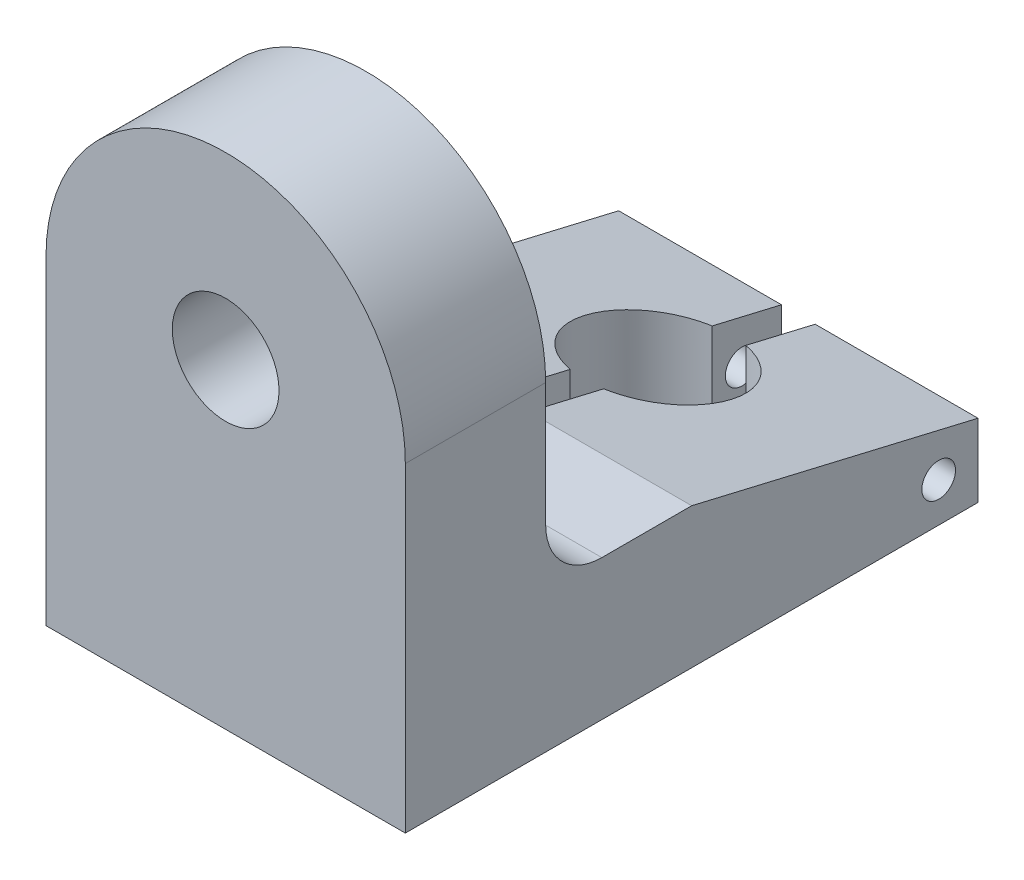
ISO-10303-21;
HEADER;
FILE_DESCRIPTION(('STEP AP214'),'2;1');
FILE_NAME('part.step','',(''),(''),'','','');
FILE_SCHEMA(('AUTOMOTIVE_DESIGN { 1 0 10303 214 1 1 1 1 }'));
ENDSEC;
DATA;
#1=APPLICATION_CONTEXT('core data for automotive mechanical design processes');
#2=APPLICATION_PROTOCOL_DEFINITION('international standard','automotive_design',2000,#1);
#3=PRODUCT_CONTEXT('',#1,'mechanical');
#4=PRODUCT('Part','Part','',(#3));
#5=PRODUCT_RELATED_PRODUCT_CATEGORY('part','',(#4));
#6=PRODUCT_DEFINITION_FORMATION('','',#4);
#7=PRODUCT_DEFINITION_CONTEXT('part definition',#1,'design');
#8=PRODUCT_DEFINITION('design','',#6,#7);
#9=PRODUCT_DEFINITION_SHAPE('','',#8);
#10=(LENGTH_UNIT() NAMED_UNIT(*) SI_UNIT(.MILLI.,.METRE.));
#11=(NAMED_UNIT(*) PLANE_ANGLE_UNIT() SI_UNIT($,.RADIAN.));
#12=(NAMED_UNIT(*) SI_UNIT($,.STERADIAN.) SOLID_ANGLE_UNIT());
#13=UNCERTAINTY_MEASURE_WITH_UNIT(LENGTH_MEASURE(1.E-05),#10,'distance_accuracy_value','');
#14=(GEOMETRIC_REPRESENTATION_CONTEXT(3) GLOBAL_UNCERTAINTY_ASSIGNED_CONTEXT((#13)) GLOBAL_UNIT_ASSIGNED_CONTEXT((#10,
#11,#12)) REPRESENTATION_CONTEXT('',''));
#15=CARTESIAN_POINT('',(0.,0.,0.));
#16=DIRECTION('',(0.,0.,1.));
#17=DIRECTION('',(1.,0.,0.));
#18=AXIS2_PLACEMENT_3D('',#15,#16,#17);
#19=CARTESIAN_POINT('',(-64.,0.,-77.));
#20=DIRECTION('',(0.,0.,-1.));
#21=DIRECTION('',(-1.,0.,0.));
#22=AXIS2_PLACEMENT_3D('',#19,#20,#21);
#23=PLANE('',#22);
#24=DIRECTION('',(1.,0.,0.));
#25=VECTOR('',#24,1.);
#26=CARTESIAN_POINT('',(-64.,-12.,-77.));
#27=LINE('',#26,#25);
#28=CARTESIAN_POINT('',(-29.,-12.,-77.));
#29=VERTEX_POINT('',#28);
#30=CARTESIAN_POINT('',(0.,-12.,-77.));
#31=VERTEX_POINT('',#30);
#32=EDGE_CURVE('E180',#29,#31,#27,.T.);
#33=ORIENTED_EDGE('',*,*,#32,.T.);
#34=DIRECTION('',(0.,1.,0.));
#35=VECTOR('',#34,1.);
#36=CARTESIAN_POINT('',(0.,0.,-77.));
#37=LINE('',#36,#35);
#38=CARTESIAN_POINT('',(0.,-25.,-77.));
#39=VERTEX_POINT('',#38);
#40=EDGE_CURVE('E202',#39,#31,#37,.T.);
#41=ORIENTED_EDGE('',*,*,#40,.F.);
#42=DIRECTION('',(1.,0.,0.));
#43=VECTOR('',#42,1.);
#44=CARTESIAN_POINT('',(-64.,-25.,-77.));
#45=LINE('',#44,#43);
#46=CARTESIAN_POINT('',(-29.,-25.,-77.));
#47=VERTEX_POINT('',#46);
#48=EDGE_CURVE('E188',#47,#39,#45,.T.);
#49=ORIENTED_EDGE('',*,*,#48,.F.);
#50=DIRECTION('',(0.,1.,0.));
#51=VECTOR('',#50,1.);
#52=CARTESIAN_POINT('',(-29.,-25.,-77.));
#53=LINE('',#52,#51);
#54=EDGE_CURVE('E282',#47,#29,#53,.T.);
#55=ORIENTED_EDGE('',*,*,#54,.T.);
#56=EDGE_LOOP('',(#33,#41,#49,#55));
#57=FACE_BOUND('',#56,.T.);
#58=ADVANCED_FACE('F39',(#57),#23,.T.);
#59=CARTESIAN_POINT('',(-32.,-25.,-52.));
#60=DIRECTION('',(0.,1.,0.));
#61=DIRECTION('',(0.,0.,1.));
#62=AXIS2_PLACEMENT_3D('',#59,#60,#61);
#63=CYLINDRICAL_SURFACE('',#62,13.);
#64=DIRECTION('',(0.,1.,0.));
#65=VECTOR('',#64,1.);
#66=CARTESIAN_POINT('',(-29.,-25.,-39.3508893593265));
#67=LINE('',#66,#65);
#68=CARTESIAN_POINT('',(-29.,-25.,-39.3508893593265));
#69=VERTEX_POINT('',#68);
#70=CARTESIAN_POINT('',(-29.,-3.14138573160623,-39.3508893593265));
#71=VERTEX_POINT('',#70);
#72=EDGE_CURVE('E227',#69,#71,#67,.T.);
#73=ORIENTED_EDGE('',*,*,#72,.T.);
#74=CARTESIAN_POINT('',(-32.,-6.11764705882353,-52.));
#75=DIRECTION('',(0.,-0.973417168333576,0.229039333725547));
#76=DIRECTION('',(0.,0.229039333725547,0.973417168333576));
#77=AXIS2_PLACEMENT_3D('',#74,#75,#76);
#78=ELLIPSE('',#77,13.355014091497,13.);
#79=CARTESIAN_POINT('',(-29.,-9.09390838604083,-64.6491106406735));
#80=VERTEX_POINT('',#79);
#81=EDGE_CURVE('E255',#71,#80,#78,.F.);
#82=ORIENTED_EDGE('',*,*,#81,.T.);
#83=DIRECTION('',(0.,1.,0.));
#84=VECTOR('',#83,1.);
#85=CARTESIAN_POINT('',(-29.,-25.,-64.6491106406735));
#86=LINE('',#85,#84);
#87=CARTESIAN_POINT('',(-29.,-25.,-64.6491106406735));
#88=VERTEX_POINT('',#87);
#89=EDGE_CURVE('E230',#80,#88,#86,.F.);
#90=ORIENTED_EDGE('',*,*,#89,.T.);
#91=CARTESIAN_POINT('',(-32.,-25.,-52.));
#92=DIRECTION('',(0.,1.,0.));
#93=DIRECTION('',(0.,0.,1.));
#94=AXIS2_PLACEMENT_3D('',#91,#92,#93);
#95=CIRCLE('',#94,13.);
#96=EDGE_CURVE('E197',#69,#88,#95,.T.);
#97=ORIENTED_EDGE('',*,*,#96,.F.);
#98=EDGE_LOOP('',(#73,#82,#90,#97));
#99=FACE_BOUND('',#98,.T.);
#100=ADVANCED_FACE('F335',(#99),#63,.F.);
#101=CARTESIAN_POINT('',(-32.,32.,0.));
#102=DIRECTION('',(0.,0.,1.));
#103=DIRECTION('',(1.,0.,0.));
#104=AXIS2_PLACEMENT_3D('',#101,#102,#103);
#105=CYLINDRICAL_SURFACE('',#104,32.);
#106=DIRECTION('',(0.,0.,1.));
#107=VECTOR('',#106,1.);
#108=CARTESIAN_POINT('',(0.,32.,0.));
#109=LINE('',#108,#107);
#110=CARTESIAN_POINT('',(0.,32.,0.));
#111=VERTEX_POINT('',#110);
#112=CARTESIAN_POINT('',(0.,32.,25.));
#113=VERTEX_POINT('',#112);
#114=EDGE_CURVE('E210',#111,#113,#109,.T.);
#115=ORIENTED_EDGE('',*,*,#114,.F.);
#116=CARTESIAN_POINT('',(-32.,32.,0.));
#117=DIRECTION('',(0.,0.,-1.));
#118=DIRECTION('',(-1.,0.,0.));
#119=AXIS2_PLACEMENT_3D('',#116,#117,#118);
#120=CIRCLE('',#119,32.);
#121=CARTESIAN_POINT('',(-64.,32.,0.));
#122=VERTEX_POINT('',#121);
#123=EDGE_CURVE('E217',#122,#111,#120,.T.);
#124=ORIENTED_EDGE('',*,*,#123,.F.);
#125=DIRECTION('',(0.,0.,-1.));
#126=VECTOR('',#125,1.);
#127=CARTESIAN_POINT('',(-64.,32.,0.));
#128=LINE('',#127,#126);
#129=CARTESIAN_POINT('',(-64.,32.,25.));
#130=VERTEX_POINT('',#129);
#131=EDGE_CURVE('E214',#130,#122,#128,.T.);
#132=ORIENTED_EDGE('',*,*,#131,.F.);
#133=CARTESIAN_POINT('',(-32.,32.,25.));
#134=DIRECTION('',(0.,0.,1.));
#135=DIRECTION('',(1.,0.,0.));
#136=AXIS2_PLACEMENT_3D('',#133,#134,#135);
#137=CIRCLE('',#136,32.);
#138=EDGE_CURVE('E220',#113,#130,#137,.T.);
#139=ORIENTED_EDGE('',*,*,#138,.F.);
#140=EDGE_LOOP('',(#115,#124,#132,#139));
#141=FACE_BOUND('',#140,.T.);
#142=ADVANCED_FACE('F348',(#141),#105,.T.);
#143=CARTESIAN_POINT('',(-64.,64.,0.));
#144=DIRECTION('',(0.,0.,-1.));
#145=DIRECTION('',(-1.,0.,0.));
#146=AXIS2_PLACEMENT_3D('',#143,#144,#145);
#147=PLANE('',#146);
#148=CARTESIAN_POINT('',(-32.,32.,0.));
#149=DIRECTION('',(0.,0.,-1.));
#150=DIRECTION('',(-1.,0.,0.));
#151=AXIS2_PLACEMENT_3D('',#148,#149,#150);
#152=CIRCLE('',#151,17.5);
#153=CARTESIAN_POINT('',(-49.5,32.,0.));
#154=VERTEX_POINT('',#153);
#155=EDGE_CURVE('E11',#154,#154,#152,.F.);
#156=ORIENTED_EDGE('',*,*,#155,.T.);
#157=EDGE_LOOP('',(#156));
#158=FACE_BOUND('',#157,.T.);
#159=DIRECTION('',(0.,1.,0.));
#160=VECTOR('',#159,1.);
#161=CARTESIAN_POINT('',(0.,64.,0.));
#162=LINE('',#161,#160);
#163=CARTESIAN_POINT('',(0.,10.,0.));
#164=VERTEX_POINT('',#163);
#165=EDGE_CURVE('E194',#164,#111,#162,.T.);
#166=ORIENTED_EDGE('',*,*,#165,.F.);
#167=DIRECTION('',(1.,0.,0.));
#168=VECTOR('',#167,1.);
#169=CARTESIAN_POINT('',(-64.,10.,0.));
#170=LINE('',#169,#168);
#171=CARTESIAN_POINT('',(-64.,10.,0.));
#172=VERTEX_POINT('',#171);
#173=EDGE_CURVE('E61',#164,#172,#170,.F.);
#174=ORIENTED_EDGE('',*,*,#173,.T.);
#175=DIRECTION('',(0.,1.,0.));
#176=VECTOR('',#175,1.);
#177=CARTESIAN_POINT('',(-64.,64.,0.));
#178=LINE('',#177,#176);
#179=EDGE_CURVE('E207',#172,#122,#178,.T.);
#180=ORIENTED_EDGE('',*,*,#179,.T.);
#181=ORIENTED_EDGE('',*,*,#123,.T.);
#182=EDGE_LOOP('',(#166,#174,#180,#181));
#183=FACE_BOUND('',#182,.T.);
#184=ADVANCED_FACE('F374',(#158,#183),#147,.T.);
#185=CARTESIAN_POINT('',(-64.,0.,0.));
#186=DIRECTION('',(0.,1.,0.));
#187=DIRECTION('',(0.,0.,1.));
#188=AXIS2_PLACEMENT_3D('',#185,#186,#187);
#189=PLANE('',#188);
#190=DIRECTION('',(0.,0.,1.));
#191=VECTOR('',#190,1.);
#192=CARTESIAN_POINT('',(-64.,0.,0.));
#193=LINE('',#192,#191);
#194=CARTESIAN_POINT('',(-64.,0.,-26.));
#195=VERTEX_POINT('',#194);
#196=CARTESIAN_POINT('',(-64.,0.,-10.));
#197=VERTEX_POINT('',#196);
#198=EDGE_CURVE('E176',#195,#197,#193,.T.);
#199=ORIENTED_EDGE('',*,*,#198,.T.);
#200=DIRECTION('',(1.,0.,0.));
#201=VECTOR('',#200,1.);
#202=CARTESIAN_POINT('',(0.,0.,-10.));
#203=LINE('',#202,#201);
#204=CARTESIAN_POINT('',(0.,0.,-10.));
#205=VERTEX_POINT('',#204);
#206=EDGE_CURVE('E235',#197,#205,#203,.T.);
#207=ORIENTED_EDGE('',*,*,#206,.T.);
#208=DIRECTION('',(0.,0.,1.));
#209=VECTOR('',#208,1.);
#210=CARTESIAN_POINT('',(0.,0.,0.));
#211=LINE('',#210,#209);
#212=CARTESIAN_POINT('',(0.,0.,-26.));
#213=VERTEX_POINT('',#212);
#214=EDGE_CURVE('E205',#213,#205,#211,.T.);
#215=ORIENTED_EDGE('',*,*,#214,.F.);
#216=DIRECTION('',(1.,0.,0.));
#217=VECTOR('',#216,1.);
#218=CARTESIAN_POINT('',(-64.,0.,-26.));
#219=LINE('',#218,#217);
#220=CARTESIAN_POINT('',(-29.,0.,-26.));
#221=VERTEX_POINT('',#220);
#222=EDGE_CURVE('E168',#221,#213,#219,.T.);
#223=ORIENTED_EDGE('',*,*,#222,.F.);
#224=DIRECTION('',(0.,0.,-1.));
#225=VECTOR('',#224,1.);
#226=CARTESIAN_POINT('',(-29.,0.,-77.));
#227=LINE('',#226,#225);
#228=CARTESIAN_POINT('',(-29.,0.,-13.));
#229=VERTEX_POINT('',#228);
#230=EDGE_CURVE('E270',#229,#221,#227,.T.);
#231=ORIENTED_EDGE('',*,*,#230,.F.);
#232=DIRECTION('',(1.,0.,0.));
#233=VECTOR('',#232,1.);
#234=CARTESIAN_POINT('',(-35.,0.,-13.));
#235=LINE('',#234,#233);
#236=CARTESIAN_POINT('',(-35.,0.,-13.));
#237=VERTEX_POINT('',#236);
#238=EDGE_CURVE('E286',#237,#229,#235,.T.);
#239=ORIENTED_EDGE('',*,*,#238,.F.);
#240=DIRECTION('',(0.,0.,1.));
#241=VECTOR('',#240,1.);
#242=CARTESIAN_POINT('',(-35.,0.,-77.));
#243=LINE('',#242,#241);
#244=CARTESIAN_POINT('',(-35.,0.,-26.));
#245=VERTEX_POINT('',#244);
#246=EDGE_CURVE('E179',#245,#237,#243,.T.);
#247=ORIENTED_EDGE('',*,*,#246,.F.);
#248=EDGE_CURVE('E160',#195,#245,#219,.T.);
#249=ORIENTED_EDGE('',*,*,#248,.F.);
#250=EDGE_LOOP('',(#199,#207,#215,#223,#231,#239,#247,#249));
#251=FACE_BOUND('',#250,.T.);
#252=ADVANCED_FACE('F174',(#251),#189,.T.);
#253=CARTESIAN_POINT('',(-64.,-12.,-77.));
#254=VERTEX_POINT('',#253);
#255=CARTESIAN_POINT('',(-35.,-12.,-77.));
#256=VERTEX_POINT('',#255);
#257=EDGE_CURVE('E163',#254,#256,#27,.T.);
#258=ORIENTED_EDGE('',*,*,#257,.T.);
#259=DIRECTION('',(0.,1.,0.));
#260=VECTOR('',#259,1.);
#261=CARTESIAN_POINT('',(-35.,-25.,-77.));
#262=LINE('',#261,#260);
#263=CARTESIAN_POINT('',(-35.,-25.,-77.));
#264=VERTEX_POINT('',#263);
#265=EDGE_CURVE('E295',#264,#256,#262,.T.);
#266=ORIENTED_EDGE('',*,*,#265,.F.);
#267=CARTESIAN_POINT('',(-64.,-25.,-77.));
#268=VERTEX_POINT('',#267);
#269=EDGE_CURVE('E208',#268,#264,#45,.T.);
#270=ORIENTED_EDGE('',*,*,#269,.F.);
#271=DIRECTION('',(0.,1.,0.));
#272=VECTOR('',#271,1.);
#273=CARTESIAN_POINT('',(-64.,0.,-77.));
#274=LINE('',#273,#272);
#275=EDGE_CURVE('E185',#268,#254,#274,.T.);
#276=ORIENTED_EDGE('',*,*,#275,.T.);
#277=EDGE_LOOP('',(#258,#266,#270,#276));
#278=FACE_BOUND('',#277,.T.);
#279=ADVANCED_FACE('F313',(#278),#23,.T.);
#280=CARTESIAN_POINT('',(-64.,-25.,-77.));
#281=DIRECTION('',(0.,-1.,0.));
#282=DIRECTION('',(0.,0.,-1.));
#283=AXIS2_PLACEMENT_3D('',#280,#281,#282);
#284=PLANE('',#283);
#285=DIRECTION('',(0.,0.,-1.));
#286=VECTOR('',#285,1.);
#287=CARTESIAN_POINT('',(-29.,-25.,-77.));
#288=LINE('',#287,#286);
#289=EDGE_CURVE('E275',#88,#47,#288,.T.);
#290=ORIENTED_EDGE('',*,*,#289,.T.);
#291=ORIENTED_EDGE('',*,*,#48,.T.);
#292=DIRECTION('',(0.,0.,-1.));
#293=VECTOR('',#292,1.);
#294=CARTESIAN_POINT('',(0.,-25.,-77.));
#295=LINE('',#294,#293);
#296=CARTESIAN_POINT('',(0.,-25.,25.));
#297=VERTEX_POINT('',#296);
#298=EDGE_CURVE('E199',#297,#39,#295,.T.);
#299=ORIENTED_EDGE('',*,*,#298,.F.);
#300=DIRECTION('',(1.,0.,0.));
#301=VECTOR('',#300,1.);
#302=CARTESIAN_POINT('',(-64.,-25.,25.));
#303=LINE('',#302,#301);
#304=CARTESIAN_POINT('',(-64.,-25.,25.));
#305=VERTEX_POINT('',#304);
#306=EDGE_CURVE('E184',#305,#297,#303,.T.);
#307=ORIENTED_EDGE('',*,*,#306,.F.);
#308=DIRECTION('',(0.,0.,-1.));
#309=VECTOR('',#308,1.);
#310=CARTESIAN_POINT('',(-64.,-25.,-77.));
#311=LINE('',#310,#309);
#312=EDGE_CURVE('E190',#305,#268,#311,.T.);
#313=ORIENTED_EDGE('',*,*,#312,.T.);
#314=ORIENTED_EDGE('',*,*,#269,.T.);
#315=DIRECTION('',(0.,0.,1.));
#316=VECTOR('',#315,1.);
#317=CARTESIAN_POINT('',(-35.,-25.,-77.));
#318=LINE('',#317,#316);
#319=CARTESIAN_POINT('',(-35.,-25.,-64.6491106406735));
#320=VERTEX_POINT('',#319);
#321=EDGE_CURVE('E276',#264,#320,#318,.T.);
#322=ORIENTED_EDGE('',*,*,#321,.T.);
#323=CARTESIAN_POINT('',(-35.,-25.,-39.3508893593265));
#324=VERTEX_POINT('',#323);
#325=EDGE_CURVE('E291',#320,#324,#95,.T.);
#326=ORIENTED_EDGE('',*,*,#325,.T.);
#327=CARTESIAN_POINT('',(-35.,-25.,-13.));
#328=VERTEX_POINT('',#327);
#329=EDGE_CURVE('E274',#324,#328,#318,.T.);
#330=ORIENTED_EDGE('',*,*,#329,.T.);
#331=DIRECTION('',(1.,0.,0.));
#332=VECTOR('',#331,1.);
#333=CARTESIAN_POINT('',(-35.,-25.,-13.));
#334=LINE('',#333,#332);
#335=CARTESIAN_POINT('',(-29.,-25.,-13.));
#336=VERTEX_POINT('',#335);
#337=EDGE_CURVE('E279',#328,#336,#334,.T.);
#338=ORIENTED_EDGE('',*,*,#337,.T.);
#339=EDGE_CURVE('E271',#336,#69,#288,.T.);
#340=ORIENTED_EDGE('',*,*,#339,.T.);
#341=ORIENTED_EDGE('',*,*,#96,.T.);
#342=EDGE_LOOP('',(#290,#291,#299,#307,#313,#314,#322,#326,#330,#338,#340,#341));
#343=FACE_BOUND('',#342,.T.);
#344=ADVANCED_FACE('F309',(#343),#284,.T.);
#345=CARTESIAN_POINT('',(-64.,-25.,25.));
#346=DIRECTION('',(0.,0.,1.));
#347=DIRECTION('',(1.,0.,0.));
#348=AXIS2_PLACEMENT_3D('',#345,#346,#347);
#349=PLANE('',#348);
#350=CARTESIAN_POINT('',(-32.,32.,25.));
#351=DIRECTION('',(0.,0.,-1.));
#352=DIRECTION('',(-1.,0.,0.));
#353=AXIS2_PLACEMENT_3D('',#350,#351,#352);
#354=CIRCLE('',#353,9.5);
#355=CARTESIAN_POINT('',(-41.5,32.,25.));
#356=VERTEX_POINT('',#355);
#357=EDGE_CURVE('E417',#356,#356,#354,.T.);
#358=ORIENTED_EDGE('',*,*,#357,.T.);
#359=EDGE_LOOP('',(#358));
#360=FACE_BOUND('',#359,.T.);
#361=DIRECTION('',(0.,-1.,0.));
#362=VECTOR('',#361,1.);
#363=CARTESIAN_POINT('',(0.,-25.,25.));
#364=LINE('',#363,#362);
#365=EDGE_CURVE('E196',#113,#297,#364,.T.);
#366=ORIENTED_EDGE('',*,*,#365,.F.);
#367=ORIENTED_EDGE('',*,*,#138,.T.);
#368=DIRECTION('',(0.,-1.,0.));
#369=VECTOR('',#368,1.);
#370=CARTESIAN_POINT('',(-64.,-25.,25.));
#371=LINE('',#370,#369);
#372=EDGE_CURVE('E303',#130,#305,#371,.T.);
#373=ORIENTED_EDGE('',*,*,#372,.T.);
#374=ORIENTED_EDGE('',*,*,#306,.T.);
#375=EDGE_LOOP('',(#366,#367,#373,#374));
#376=FACE_BOUND('',#375,.T.);
#377=ADVANCED_FACE('F344',(#360,#376),#349,.T.);
#378=CARTESIAN_POINT('',(-64.,0.,0.));
#379=DIRECTION('',(1.,0.,0.));
#380=DIRECTION('',(0.,0.,-1.));
#381=AXIS2_PLACEMENT_3D('',#378,#379,#380);
#382=PLANE('',#381);
#383=CARTESIAN_POINT('',(-64.,-18.,-70.));
#384=DIRECTION('',(1.,0.,0.));
#385=DIRECTION('',(0.,0.,-1.));
#386=AXIS2_PLACEMENT_3D('',#383,#384,#385);
#387=CIRCLE('',#386,3.00000000000001);
#388=CARTESIAN_POINT('',(-64.,-18.,-73.));
#389=VERTEX_POINT('',#388);
#390=EDGE_CURVE('E240',#389,#389,#387,.T.);
#391=ORIENTED_EDGE('',*,*,#390,.T.);
#392=EDGE_LOOP('',(#391));
#393=FACE_BOUND('',#392,.T.);
#394=ORIENTED_EDGE('',*,*,#198,.F.);
#395=DIRECTION('',(0.,-0.229039333725547,-0.973417168333576));
#396=VECTOR('',#395,1.);
#397=CARTESIAN_POINT('',(-64.,0.,-26.));
#398=LINE('',#397,#396);
#399=EDGE_CURVE('E157',#195,#254,#398,.T.);
#400=ORIENTED_EDGE('',*,*,#399,.T.);
#401=ORIENTED_EDGE('',*,*,#275,.F.);
#402=ORIENTED_EDGE('',*,*,#312,.F.);
#403=ORIENTED_EDGE('',*,*,#372,.F.);
#404=ORIENTED_EDGE('',*,*,#131,.T.);
#405=ORIENTED_EDGE('',*,*,#179,.F.);
#406=CARTESIAN_POINT('',(-64.,10.,-10.));
#407=DIRECTION('',(1.,0.,0.));
#408=DIRECTION('',(0.,0.,-1.));
#409=AXIS2_PLACEMENT_3D('',#406,#407,#408);
#410=CIRCLE('',#409,10.);
#411=EDGE_CURVE('E47',#172,#197,#410,.T.);
#412=ORIENTED_EDGE('',*,*,#411,.T.);
#413=EDGE_LOOP('',(#394,#400,#401,#402,#403,#404,#405,#412));
#414=FACE_BOUND('',#413,.T.);
#415=ADVANCED_FACE('F182',(#393,#414),#382,.F.);
#416=CARTESIAN_POINT('',(0.,0.,0.));
#417=DIRECTION('',(1.,0.,0.));
#418=DIRECTION('',(0.,0.,-1.));
#419=AXIS2_PLACEMENT_3D('',#416,#417,#418);
#420=PLANE('',#419);
#421=CARTESIAN_POINT('',(0.,-18.,-70.));
#422=DIRECTION('',(1.,0.,0.));
#423=DIRECTION('',(0.,0.,-1.));
#424=AXIS2_PLACEMENT_3D('',#421,#422,#423);
#425=CIRCLE('',#424,3.00000000000001);
#426=CARTESIAN_POINT('',(0.,-18.,-73.));
#427=VERTEX_POINT('',#426);
#428=EDGE_CURVE('E416',#427,#427,#425,.T.);
#429=ORIENTED_EDGE('',*,*,#428,.F.);
#430=EDGE_LOOP('',(#429));
#431=FACE_BOUND('',#430,.T.);
#432=DIRECTION('',(0.,-0.229039333725547,-0.973417168333576));
#433=VECTOR('',#432,1.);
#434=CARTESIAN_POINT('',(0.,0.,-26.));
#435=LINE('',#434,#433);
#436=EDGE_CURVE('E169',#213,#31,#435,.T.);
#437=ORIENTED_EDGE('',*,*,#436,.F.);
#438=ORIENTED_EDGE('',*,*,#214,.T.);
#439=CARTESIAN_POINT('',(0.,10.,-10.));
#440=DIRECTION('',(1.,0.,0.));
#441=DIRECTION('',(0.,0.,-1.));
#442=AXIS2_PLACEMENT_3D('',#439,#440,#441);
#443=CIRCLE('',#442,10.);
#444=EDGE_CURVE('E54',#205,#164,#443,.F.);
#445=ORIENTED_EDGE('',*,*,#444,.T.);
#446=ORIENTED_EDGE('',*,*,#165,.T.);
#447=ORIENTED_EDGE('',*,*,#114,.T.);
#448=ORIENTED_EDGE('',*,*,#365,.T.);
#449=ORIENTED_EDGE('',*,*,#298,.T.);
#450=ORIENTED_EDGE('',*,*,#40,.T.);
#451=EDGE_LOOP('',(#437,#438,#445,#446,#447,#448,#449,#450));
#452=FACE_BOUND('',#451,.T.);
#453=ADVANCED_FACE('F247',(#431,#452),#420,.T.);
#454=DIRECTION('',(0.,1.,0.));
#455=VECTOR('',#454,1.);
#456=CARTESIAN_POINT('',(-35.,-25.,-64.6491106406735));
#457=LINE('',#456,#455);
#458=CARTESIAN_POINT('',(-35.,-9.09390838604082,-64.6491106406735));
#459=VERTEX_POINT('',#458);
#460=EDGE_CURVE('E222',#320,#459,#457,.T.);
#461=ORIENTED_EDGE('',*,*,#460,.T.);
#462=CARTESIAN_POINT('',(-32.,-6.11764705882353,-52.));
#463=DIRECTION('',(0.,-0.973417168333576,0.229039333725547));
#464=DIRECTION('',(0.,0.229039333725547,0.973417168333576));
#465=AXIS2_PLACEMENT_3D('',#462,#463,#464);
#466=ELLIPSE('',#465,13.355014091497,13.);
#467=CARTESIAN_POINT('',(-35.,-3.14138573160623,-39.3508893593265));
#468=VERTEX_POINT('',#467);
#469=EDGE_CURVE('E264',#459,#468,#466,.F.);
#470=ORIENTED_EDGE('',*,*,#469,.T.);
#471=DIRECTION('',(0.,1.,0.));
#472=VECTOR('',#471,1.);
#473=CARTESIAN_POINT('',(-35.,-25.,-39.3508893593265));
#474=LINE('',#473,#472);
#475=EDGE_CURVE('E225',#468,#324,#474,.F.);
#476=ORIENTED_EDGE('',*,*,#475,.T.);
#477=ORIENTED_EDGE('',*,*,#325,.F.);
#478=EDGE_LOOP('',(#461,#470,#476,#477));
#479=FACE_BOUND('',#478,.T.);
#480=ADVANCED_FACE('F321',(#479),#63,.F.);
#481=CARTESIAN_POINT('',(-35.,-25.,-77.));
#482=DIRECTION('',(-1.,0.,0.));
#483=DIRECTION('',(0.,0.,1.));
#484=AXIS2_PLACEMENT_3D('',#481,#482,#483);
#485=PLANE('',#484);
#486=CARTESIAN_POINT('',(-35.,-18.,-70.));
#487=DIRECTION('',(-1.,0.,0.));
#488=DIRECTION('',(0.,0.,1.));
#489=AXIS2_PLACEMENT_3D('',#486,#487,#488);
#490=CIRCLE('',#489,3.00000000000001);
#491=CARTESIAN_POINT('',(-35.,-18.,-67.));
#492=VERTEX_POINT('',#491);
#493=EDGE_CURVE('E239',#492,#492,#490,.T.);
#494=ORIENTED_EDGE('',*,*,#493,.T.);
#495=EDGE_LOOP('',(#494));
#496=FACE_BOUND('',#495,.T.);
#497=ORIENTED_EDGE('',*,*,#265,.T.);
#498=DIRECTION('',(0.,0.229039333725547,0.973417168333576));
#499=VECTOR('',#498,1.);
#500=CARTESIAN_POINT('',(-35.,-12.6819672131148,-79.8983606557377));
#501=LINE('',#500,#499);
#502=EDGE_CURVE('E267',#256,#459,#501,.T.);
#503=ORIENTED_EDGE('',*,*,#502,.T.);
#504=ORIENTED_EDGE('',*,*,#460,.F.);
#505=ORIENTED_EDGE('',*,*,#321,.F.);
#506=EDGE_LOOP('',(#497,#503,#504,#505));
#507=FACE_BOUND('',#506,.T.);
#508=ADVANCED_FACE('F316',(#496,#507),#485,.F.);
#509=CARTESIAN_POINT('',(-29.,-25.,-77.));
#510=DIRECTION('',(1.,0.,0.));
#511=DIRECTION('',(0.,0.,-1.));
#512=AXIS2_PLACEMENT_3D('',#509,#510,#511);
#513=PLANE('',#512);
#514=ORIENTED_EDGE('',*,*,#230,.T.);
#515=DIRECTION('',(0.,-0.229039333725547,-0.973417168333576));
#516=VECTOR('',#515,1.);
#517=CARTESIAN_POINT('',(-29.,-12.6819672131148,-79.8983606557377));
#518=LINE('',#517,#516);
#519=EDGE_CURVE('E259',#221,#71,#518,.T.);
#520=ORIENTED_EDGE('',*,*,#519,.T.);
#521=ORIENTED_EDGE('',*,*,#72,.F.);
#522=ORIENTED_EDGE('',*,*,#339,.F.);
#523=DIRECTION('',(0.,1.,0.));
#524=VECTOR('',#523,1.);
#525=CARTESIAN_POINT('',(-29.,-25.,-13.));
#526=LINE('',#525,#524);
#527=EDGE_CURVE('E289',#336,#229,#526,.T.);
#528=ORIENTED_EDGE('',*,*,#527,.T.);
#529=EDGE_LOOP('',(#514,#520,#521,#522,#528));
#530=FACE_BOUND('',#529,.T.);
#531=ADVANCED_FACE('F333',(#530),#513,.F.);
#532=ORIENTED_EDGE('',*,*,#475,.F.);
#533=DIRECTION('',(0.,0.229039333725547,0.973417168333576));
#534=VECTOR('',#533,1.);
#535=CARTESIAN_POINT('',(-35.,-12.6819672131148,-79.8983606557377));
#536=LINE('',#535,#534);
#537=EDGE_CURVE('E262',#468,#245,#536,.T.);
#538=ORIENTED_EDGE('',*,*,#537,.T.);
#539=ORIENTED_EDGE('',*,*,#246,.T.);
#540=DIRECTION('',(0.,1.,0.));
#541=VECTOR('',#540,1.);
#542=CARTESIAN_POINT('',(-35.,-25.,-13.));
#543=LINE('',#542,#541);
#544=EDGE_CURVE('E292',#328,#237,#543,.T.);
#545=ORIENTED_EDGE('',*,*,#544,.F.);
#546=ORIENTED_EDGE('',*,*,#329,.F.);
#547=EDGE_LOOP('',(#532,#538,#539,#545,#546));
#548=FACE_BOUND('',#547,.T.);
#549=ADVANCED_FACE('F325',(#548),#485,.F.);
#550=CARTESIAN_POINT('',(-35.,-25.,-13.));
#551=DIRECTION('',(0.,0.,1.));
#552=DIRECTION('',(1.,0.,0.));
#553=AXIS2_PLACEMENT_3D('',#550,#551,#552);
#554=PLANE('',#553);
#555=ORIENTED_EDGE('',*,*,#238,.T.);
#556=ORIENTED_EDGE('',*,*,#527,.F.);
#557=ORIENTED_EDGE('',*,*,#337,.F.);
#558=ORIENTED_EDGE('',*,*,#544,.T.);
#559=EDGE_LOOP('',(#555,#556,#557,#558));
#560=FACE_BOUND('',#559,.T.);
#561=ADVANCED_FACE('F330',(#560),#554,.F.);
#562=CARTESIAN_POINT('',(-29.,-18.,-70.));
#563=DIRECTION('',(1.,0.,0.));
#564=DIRECTION('',(0.,0.,-1.));
#565=AXIS2_PLACEMENT_3D('',#562,#563,#564);
#566=CIRCLE('',#565,3.00000000000001);
#567=CARTESIAN_POINT('',(-29.,-18.,-73.));
#568=VERTEX_POINT('',#567);
#569=EDGE_CURVE('E236',#568,#568,#566,.T.);
#570=ORIENTED_EDGE('',*,*,#569,.T.);
#571=EDGE_LOOP('',(#570));
#572=FACE_BOUND('',#571,.T.);
#573=ORIENTED_EDGE('',*,*,#89,.F.);
#574=DIRECTION('',(0.,-0.229039333725547,-0.973417168333576));
#575=VECTOR('',#574,1.);
#576=CARTESIAN_POINT('',(-29.,-12.6819672131148,-79.8983606557377));
#577=LINE('',#576,#575);
#578=EDGE_CURVE('E232',#80,#29,#577,.T.);
#579=ORIENTED_EDGE('',*,*,#578,.T.);
#580=ORIENTED_EDGE('',*,*,#54,.F.);
#581=ORIENTED_EDGE('',*,*,#289,.F.);
#582=EDGE_LOOP('',(#573,#579,#580,#581));
#583=FACE_BOUND('',#582,.T.);
#584=ADVANCED_FACE('F388',(#572,#583),#513,.F.);
#585=CARTESIAN_POINT('',(-64.,0.,-26.));
#586=DIRECTION('',(0.,-0.973417168333576,0.229039333725547));
#587=DIRECTION('',(0.,-0.229039333725547,-0.973417168333576));
#588=AXIS2_PLACEMENT_3D('',#585,#586,#587);
#589=PLANE('',#588);
#590=ORIENTED_EDGE('',*,*,#222,.T.);
#591=ORIENTED_EDGE('',*,*,#436,.T.);
#592=ORIENTED_EDGE('',*,*,#32,.F.);
#593=ORIENTED_EDGE('',*,*,#578,.F.);
#594=ORIENTED_EDGE('',*,*,#81,.F.);
#595=ORIENTED_EDGE('',*,*,#519,.F.);
#596=EDGE_LOOP('',(#590,#591,#592,#593,#594,#595));
#597=FACE_BOUND('',#596,.T.);
#598=ADVANCED_FACE('F391',(#597),#589,.F.);
#599=ORIENTED_EDGE('',*,*,#257,.F.);
#600=ORIENTED_EDGE('',*,*,#399,.F.);
#601=ORIENTED_EDGE('',*,*,#248,.T.);
#602=ORIENTED_EDGE('',*,*,#537,.F.);
#603=ORIENTED_EDGE('',*,*,#469,.F.);
#604=ORIENTED_EDGE('',*,*,#502,.F.);
#605=EDGE_LOOP('',(#599,#600,#601,#602,#603,#604));
#606=FACE_BOUND('',#605,.T.);
#607=ADVANCED_FACE('F159',(#606),#589,.F.);
#608=CARTESIAN_POINT('',(-64.,-18.,-70.));
#609=DIRECTION('',(1.,0.,0.));
#610=DIRECTION('',(0.,0.,-1.));
#611=AXIS2_PLACEMENT_3D('',#608,#609,#610);
#612=CYLINDRICAL_SURFACE('',#611,3.00000000000001);
#613=ORIENTED_EDGE('',*,*,#428,.T.);
#614=EDGE_LOOP('',(#613));
#615=FACE_BOUND('',#614,.T.);
#616=ORIENTED_EDGE('',*,*,#569,.F.);
#617=EDGE_LOOP('',(#616));
#618=FACE_BOUND('',#617,.T.);
#619=ADVANCED_FACE('F399',(#615,#618),#612,.F.);
#620=ORIENTED_EDGE('',*,*,#390,.F.);
#621=EDGE_LOOP('',(#620));
#622=FACE_BOUND('',#621,.T.);
#623=ORIENTED_EDGE('',*,*,#493,.F.);
#624=EDGE_LOOP('',(#623));
#625=FACE_BOUND('',#624,.T.);
#626=ADVANCED_FACE('F400',(#622,#625),#612,.F.);
#627=CARTESIAN_POINT('',(-32.,32.,-5.));
#628=DIRECTION('',(0.,0.,-1.));
#629=DIRECTION('',(-1.,0.,0.));
#630=AXIS2_PLACEMENT_3D('',#627,#628,#629);
#631=PLANE('',#630);
#632=CARTESIAN_POINT('',(-32.,32.,-5.));
#633=DIRECTION('',(0.,0.,-1.));
#634=DIRECTION('',(-1.,0.,0.));
#635=AXIS2_PLACEMENT_3D('',#632,#633,#634);
#636=CIRCLE('',#635,9.5);
#637=CARTESIAN_POINT('',(-41.5,32.,-5.));
#638=VERTEX_POINT('',#637);
#639=EDGE_CURVE('E411',#638,#638,#636,.T.);
#640=ORIENTED_EDGE('',*,*,#639,.F.);
#641=EDGE_LOOP('',(#640));
#642=FACE_BOUND('',#641,.T.);
#643=CARTESIAN_POINT('',(-32.,32.,-5.));
#644=DIRECTION('',(0.,0.,-1.));
#645=DIRECTION('',(-1.,0.,0.));
#646=AXIS2_PLACEMENT_3D('',#643,#644,#645);
#647=CIRCLE('',#646,12.5);
#648=CARTESIAN_POINT('',(-44.5,32.,-5.));
#649=VERTEX_POINT('',#648);
#650=EDGE_CURVE('E414',#649,#649,#647,.T.);
#651=ORIENTED_EDGE('',*,*,#650,.T.);
#652=EDGE_LOOP('',(#651));
#653=FACE_BOUND('',#652,.T.);
#654=ADVANCED_FACE('F357',(#642,#653),#631,.T.);
#655=CARTESIAN_POINT('',(-32.,32.,25.));
#656=DIRECTION('',(0.,0.,-1.));
#657=DIRECTION('',(-1.,0.,0.));
#658=AXIS2_PLACEMENT_3D('',#655,#656,#657);
#659=CYLINDRICAL_SURFACE('',#658,9.5);
#660=CARTESIAN_POINT('',(-41.5,32.,25.));
#661=CARTESIAN_POINT('',(-41.5,32.,24.6875));
#662=CARTESIAN_POINT('',(-41.5,32.,24.375));
#663=CARTESIAN_POINT('',(-41.5,32.,23.75));
#664=CARTESIAN_POINT('',(-41.5,32.,23.4375));
#665=CARTESIAN_POINT('',(-41.5,32.,22.8125));
#666=CARTESIAN_POINT('',(-41.5,32.,22.5));
#667=CARTESIAN_POINT('',(-41.5,32.,21.875));
#668=CARTESIAN_POINT('',(-41.5,32.,21.5625));
#669=CARTESIAN_POINT('',(-41.5,32.,20.9375));
#670=CARTESIAN_POINT('',(-41.5,32.,20.625));
#671=CARTESIAN_POINT('',(-41.5,32.,20.));
#672=CARTESIAN_POINT('',(-41.5,32.,19.6875));
#673=CARTESIAN_POINT('',(-41.5,32.,19.0625));
#674=CARTESIAN_POINT('',(-41.5,32.,18.75));
#675=CARTESIAN_POINT('',(-41.5,32.,18.125));
#676=CARTESIAN_POINT('',(-41.5,32.,17.8125));
#677=CARTESIAN_POINT('',(-41.5,32.,17.1875));
#678=CARTESIAN_POINT('',(-41.5,32.,16.875));
#679=CARTESIAN_POINT('',(-41.5,32.,16.25));
#680=CARTESIAN_POINT('',(-41.5,32.,15.9375));
#681=CARTESIAN_POINT('',(-41.5,32.,15.3125));
#682=CARTESIAN_POINT('',(-41.5,32.,15.));
#683=CARTESIAN_POINT('',(-41.5,32.,14.375));
#684=CARTESIAN_POINT('',(-41.5,32.,14.0625));
#685=CARTESIAN_POINT('',(-41.5,32.,13.4375));
#686=CARTESIAN_POINT('',(-41.5,32.,13.125));
#687=CARTESIAN_POINT('',(-41.5,32.,12.5));
#688=CARTESIAN_POINT('',(-41.5,32.,12.1875));
#689=CARTESIAN_POINT('',(-41.5,32.,11.5625));
#690=CARTESIAN_POINT('',(-41.5,32.,11.25));
#691=CARTESIAN_POINT('',(-41.5,32.,10.625));
#692=CARTESIAN_POINT('',(-41.5,32.,10.3125));
#693=CARTESIAN_POINT('',(-41.5,32.,9.6875));
#694=CARTESIAN_POINT('',(-41.5,32.,9.375));
#695=CARTESIAN_POINT('',(-41.5,32.,8.75));
#696=CARTESIAN_POINT('',(-41.5,32.,8.4375));
#697=CARTESIAN_POINT('',(-41.5,32.,7.8125));
#698=CARTESIAN_POINT('',(-41.5,32.,7.5));
#699=CARTESIAN_POINT('',(-41.5,32.,6.875));
#700=CARTESIAN_POINT('',(-41.5,32.,6.5625));
#701=CARTESIAN_POINT('',(-41.5,32.,5.9375));
#702=CARTESIAN_POINT('',(-41.5,32.,5.625));
#703=CARTESIAN_POINT('',(-41.5,32.,5.));
#704=CARTESIAN_POINT('',(-41.5,32.,4.6875));
#705=CARTESIAN_POINT('',(-41.5,32.,4.0625));
#706=CARTESIAN_POINT('',(-41.5,32.,3.75));
#707=CARTESIAN_POINT('',(-41.5,32.,3.125));
#708=CARTESIAN_POINT('',(-41.5,32.,2.8125));
#709=CARTESIAN_POINT('',(-41.5,32.,2.1875));
#710=CARTESIAN_POINT('',(-41.5,32.,1.875));
#711=CARTESIAN_POINT('',(-41.5,32.,1.25));
#712=CARTESIAN_POINT('',(-41.5,32.,0.937500000000001));
#713=CARTESIAN_POINT('',(-41.5,32.,0.3125));
#714=CARTESIAN_POINT('',(-41.5,32.,0.));
#715=CARTESIAN_POINT('',(-41.5,32.,-0.625000000000001));
#716=CARTESIAN_POINT('',(-41.5,32.,-0.937500000000001));
#717=CARTESIAN_POINT('',(-41.5,32.,-1.5625));
#718=CARTESIAN_POINT('',(-41.5,32.,-1.875));
#719=CARTESIAN_POINT('',(-41.5,32.,-2.5));
#720=CARTESIAN_POINT('',(-41.5,32.,-2.8125));
#721=CARTESIAN_POINT('',(-41.5,32.,-3.4375));
#722=CARTESIAN_POINT('',(-41.5,32.,-3.75));
#723=CARTESIAN_POINT('',(-41.5,32.,-4.375));
#724=CARTESIAN_POINT('',(-41.5,32.,-4.6875));
#725=CARTESIAN_POINT('',(-41.5,32.,-5.));
#726=B_SPLINE_CURVE_WITH_KNOTS('',3,(#660,#661,#662,#663,#664,#665,#666,#667,#668,#669,#670,
#671,#672,#673,#674,#675,#676,#677,#678,#679,#680,#681,#682,#683,#684,#685,#686,#687,#688,#689,
#690,#691,#692,#693,#694,#695,#696,#697,#698,#699,#700,#701,#702,#703,#704,#705,#706,#707,#708,
#709,#710,#711,#712,#713,#714,#715,#716,#717,#718,#719,#720,#721,#722,#723,#724,#725),
.UNSPECIFIED.,.F.,.F.,(4,2,2,2,2,2,2,2,2,2,2,2,2,2,2,2,2,2,2,2,2,2,2,2,2,2,2,2,2,2,2,2,4),(0.,
0.937499999999997,1.875,2.8125,3.75,4.6875,5.625,6.5625,7.5,8.4375,9.375,10.3125,11.25,12.1875,
13.125,14.0625,15.,15.9375,16.875,17.8125,18.75,19.6875,20.625,21.5625,22.5,23.4375,24.375,
25.3125,26.25,27.1875,28.125,29.0625,30.),.UNSPECIFIED.);
#727=EDGE_CURVE('BSEAM351',#356,#638,#726,.T.);
#728=ORIENTED_EDGE('',*,*,#357,.F.);
#729=ORIENTED_EDGE('',*,*,#639,.T.);
#730=ORIENTED_EDGE('',*,*,#727,.T.);
#731=ORIENTED_EDGE('',*,*,#727,.F.);
#732=EDGE_LOOP('',(#728,#730,#729,#731));
#733=FACE_BOUND('',#732,.T.);
#734=ADVANCED_FACE('F351',(#733),#659,.F.);
#735=CARTESIAN_POINT('',(-64.,10.,-10.));
#736=DIRECTION('',(-1.,0.,0.));
#737=DIRECTION('',(0.,0.,1.));
#738=AXIS2_PLACEMENT_3D('',#735,#736,#737);
#739=CYLINDRICAL_SURFACE('',#738,10.);
#740=ORIENTED_EDGE('',*,*,#411,.F.);
#741=ORIENTED_EDGE('',*,*,#173,.F.);
#742=ORIENTED_EDGE('',*,*,#444,.F.);
#743=ORIENTED_EDGE('',*,*,#206,.F.);
#744=EDGE_LOOP('',(#740,#741,#742,#743));
#745=FACE_BOUND('',#744,.T.);
#746=ADVANCED_FACE('F349',(#745),#739,.F.);
#747=CARTESIAN_POINT('',(-32.,32.,-5.));
#748=DIRECTION('',(0.,0.,-1.));
#749=DIRECTION('',(-1.,0.,0.));
#750=AXIS2_PLACEMENT_3D('',#747,#748,#749);
#751=TOROIDAL_SURFACE('',#750,17.5,5.);
#752=ORIENTED_EDGE('',*,*,#155,.F.);
#753=EDGE_LOOP('',(#752));
#754=FACE_BOUND('',#753,.T.);
#755=ORIENTED_EDGE('',*,*,#650,.F.);
#756=EDGE_LOOP('',(#755));
#757=FACE_BOUND('',#756,.T.);
#758=ADVANCED_FACE('F41',(#754,#757),#751,.F.);
#759=CLOSED_SHELL('',(#58,#100,#142,#184,#252,#279,#344,#377,#415,#453,#480,#508,#531,#549,#561,
#584,#598,#607,#619,#626,#654,#734,#746,#758));
#760=MANIFOLD_SOLID_BREP('B2',#759);
#761=ADVANCED_BREP_SHAPE_REPRESENTATION('',(#18,#760),#14);
#762=SHAPE_DEFINITION_REPRESENTATION(#9,#761);
ENDSEC;
END-ISO-10303-21;
